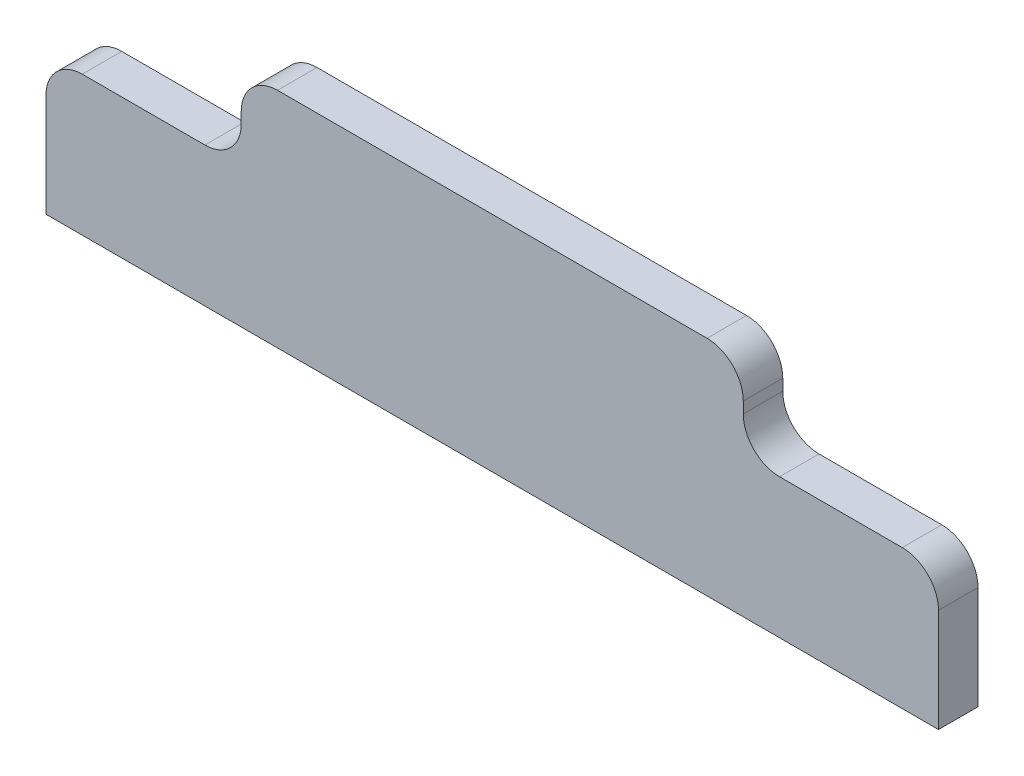
ISO-10303-21;
HEADER;
FILE_DESCRIPTION(('STEP AP214'),'2;1');
FILE_NAME('part.step','',(''),(''),'','','');
FILE_SCHEMA(('AUTOMOTIVE_DESIGN { 1 0 10303 214 1 1 1 1 }'));
ENDSEC;
DATA;
#1=APPLICATION_CONTEXT('core data for automotive mechanical design processes');
#2=APPLICATION_PROTOCOL_DEFINITION('international standard','automotive_design',2000,#1);
#3=PRODUCT_CONTEXT('',#1,'mechanical');
#4=PRODUCT('Part','Part','',(#3));
#5=PRODUCT_RELATED_PRODUCT_CATEGORY('part','',(#4));
#6=PRODUCT_DEFINITION_FORMATION('','',#4);
#7=PRODUCT_DEFINITION_CONTEXT('part definition',#1,'design');
#8=PRODUCT_DEFINITION('design','',#6,#7);
#9=PRODUCT_DEFINITION_SHAPE('','',#8);
#10=(LENGTH_UNIT() NAMED_UNIT(*) SI_UNIT(.MILLI.,.METRE.));
#11=(NAMED_UNIT(*) PLANE_ANGLE_UNIT() SI_UNIT($,.RADIAN.));
#12=(NAMED_UNIT(*) SI_UNIT($,.STERADIAN.) SOLID_ANGLE_UNIT());
#13=UNCERTAINTY_MEASURE_WITH_UNIT(LENGTH_MEASURE(1.E-05),#10,'distance_accuracy_value','');
#14=(GEOMETRIC_REPRESENTATION_CONTEXT(3) GLOBAL_UNCERTAINTY_ASSIGNED_CONTEXT((#13)) GLOBAL_UNIT_ASSIGNED_CONTEXT((#10,
#11,#12)) REPRESENTATION_CONTEXT('',''));
#15=CARTESIAN_POINT('',(0.,0.,0.));
#16=DIRECTION('',(0.,0.,1.));
#17=DIRECTION('',(1.,0.,0.));
#18=AXIS2_PLACEMENT_3D('',#15,#16,#17);
#19=CARTESIAN_POINT('',(203.2,101.6,17.9832));
#20=DIRECTION('',(0.,-1.,0.));
#21=DIRECTION('',(1.,0.,0.));
#22=AXIS2_PLACEMENT_3D('',#19,#20,#21);
#23=PLANE('',#22);
#24=DIRECTION('',(-1.,0.,0.));
#25=VECTOR('',#24,1.);
#26=CARTESIAN_POINT('',(203.2,101.6,0.));
#27=LINE('',#26,#25);
#28=CARTESIAN_POINT('',(97.79,101.6,0.));
#29=VERTEX_POINT('',#28);
#30=CARTESIAN_POINT('',(-97.79,101.6,0.));
#31=VERTEX_POINT('',#30);
#32=EDGE_CURVE('E171',#29,#31,#27,.T.);
#33=ORIENTED_EDGE('',*,*,#32,.T.);
#34=DIRECTION('',(0.,0.,1.));
#35=VECTOR('',#34,1.);
#36=CARTESIAN_POINT('',(-97.79,101.6,17.9832));
#37=LINE('',#36,#35);
#38=CARTESIAN_POINT('',(-97.79,101.6,17.9832));
#39=VERTEX_POINT('',#38);
#40=EDGE_CURVE('E195',#31,#39,#37,.T.);
#41=ORIENTED_EDGE('',*,*,#40,.T.);
#42=DIRECTION('',(-1.,0.,0.));
#43=VECTOR('',#42,1.);
#44=CARTESIAN_POINT('',(203.2,101.6,17.9832));
#45=LINE('',#44,#43);
#46=CARTESIAN_POINT('',(97.79,101.6,17.9832));
#47=VERTEX_POINT('',#46);
#48=EDGE_CURVE('E147',#47,#39,#45,.T.);
#49=ORIENTED_EDGE('',*,*,#48,.F.);
#50=DIRECTION('',(0.,0.,1.));
#51=VECTOR('',#50,1.);
#52=CARTESIAN_POINT('',(97.79,101.6,17.9832));
#53=LINE('',#52,#51);
#54=EDGE_CURVE('E193',#47,#29,#53,.F.);
#55=ORIENTED_EDGE('',*,*,#54,.T.);
#56=EDGE_LOOP('',(#33,#41,#49,#55));
#57=FACE_BOUND('',#56,.T.);
#58=ADVANCED_FACE('F34',(#57),#23,.F.);
#59=CARTESIAN_POINT('',(-203.2,101.6,17.9832));
#60=DIRECTION('',(1.,0.,0.));
#61=DIRECTION('',(0.,0.,-1.));
#62=AXIS2_PLACEMENT_3D('',#59,#60,#61);
#63=PLANE('',#62);
#64=DIRECTION('',(0.,-1.,0.));
#65=VECTOR('',#64,1.);
#66=CARTESIAN_POINT('',(-203.2,101.6,17.9832));
#67=LINE('',#66,#65);
#68=CARTESIAN_POINT('',(-203.2,46.99,17.9832));
#69=VERTEX_POINT('',#68);
#70=CARTESIAN_POINT('',(-203.2,0.,17.9832));
#71=VERTEX_POINT('',#70);
#72=EDGE_CURVE('E136',#69,#71,#67,.T.);
#73=ORIENTED_EDGE('',*,*,#72,.F.);
#74=DIRECTION('',(0.,0.,1.));
#75=VECTOR('',#74,1.);
#76=CARTESIAN_POINT('',(-203.2,46.99,17.9832));
#77=LINE('',#76,#75);
#78=CARTESIAN_POINT('',(-203.2,46.99,0.));
#79=VERTEX_POINT('',#78);
#80=EDGE_CURVE('E50',#69,#79,#77,.F.);
#81=ORIENTED_EDGE('',*,*,#80,.T.);
#82=DIRECTION('',(0.,-1.,0.));
#83=VECTOR('',#82,1.);
#84=CARTESIAN_POINT('',(-203.2,101.6,0.));
#85=LINE('',#84,#83);
#86=CARTESIAN_POINT('',(-203.2,0.,0.));
#87=VERTEX_POINT('',#86);
#88=EDGE_CURVE('E152',#79,#87,#85,.T.);
#89=ORIENTED_EDGE('',*,*,#88,.T.);
#90=DIRECTION('',(0.,0.,-1.));
#91=VECTOR('',#90,1.);
#92=CARTESIAN_POINT('',(-203.2,0.,17.9832));
#93=LINE('',#92,#91);
#94=EDGE_CURVE('E150',#71,#87,#93,.T.);
#95=ORIENTED_EDGE('',*,*,#94,.F.);
#96=EDGE_LOOP('',(#73,#81,#89,#95));
#97=FACE_BOUND('',#96,.T.);
#98=ADVANCED_FACE('F151',(#97),#63,.F.);
#99=CARTESIAN_POINT('',(203.2,0.,17.9832));
#100=DIRECTION('',(0.,1.,0.));
#101=DIRECTION('',(-1.,0.,0.));
#102=AXIS2_PLACEMENT_3D('',#99,#100,#101);
#103=PLANE('',#102);
#104=DIRECTION('',(1.,0.,0.));
#105=VECTOR('',#104,1.);
#106=CARTESIAN_POINT('',(203.2,0.,0.));
#107=LINE('',#106,#105);
#108=CARTESIAN_POINT('',(203.2,0.,0.));
#109=VERTEX_POINT('',#108);
#110=EDGE_CURVE('E177',#87,#109,#107,.T.);
#111=ORIENTED_EDGE('',*,*,#110,.T.);
#112=DIRECTION('',(0.,0.,-1.));
#113=VECTOR('',#112,1.);
#114=CARTESIAN_POINT('',(203.2,0.,17.9832));
#115=LINE('',#114,#113);
#116=CARTESIAN_POINT('',(203.2,0.,17.9832));
#117=VERTEX_POINT('',#116);
#118=EDGE_CURVE('E156',#117,#109,#115,.T.);
#119=ORIENTED_EDGE('',*,*,#118,.F.);
#120=DIRECTION('',(1.,0.,0.));
#121=VECTOR('',#120,1.);
#122=CARTESIAN_POINT('',(203.2,0.,17.9832));
#123=LINE('',#122,#121);
#124=EDGE_CURVE('E142',#71,#117,#123,.T.);
#125=ORIENTED_EDGE('',*,*,#124,.F.);
#126=ORIENTED_EDGE('',*,*,#94,.T.);
#127=EDGE_LOOP('',(#111,#119,#125,#126));
#128=FACE_BOUND('',#127,.T.);
#129=ADVANCED_FACE('F158',(#128),#103,.F.);
#130=CARTESIAN_POINT('',(203.2,101.6,17.9832));
#131=DIRECTION('',(-1.,0.,0.));
#132=DIRECTION('',(0.,0.,1.));
#133=AXIS2_PLACEMENT_3D('',#130,#131,#132);
#134=PLANE('',#133);
#135=DIRECTION('',(0.,1.,0.));
#136=VECTOR('',#135,1.);
#137=CARTESIAN_POINT('',(203.2,101.6,0.));
#138=LINE('',#137,#136);
#139=CARTESIAN_POINT('',(203.2,46.99,0.));
#140=VERTEX_POINT('',#139);
#141=EDGE_CURVE('E180',#109,#140,#138,.T.);
#142=ORIENTED_EDGE('',*,*,#141,.T.);
#143=DIRECTION('',(0.,0.,1.));
#144=VECTOR('',#143,1.);
#145=CARTESIAN_POINT('',(203.2,46.99,17.9832));
#146=LINE('',#145,#144);
#147=CARTESIAN_POINT('',(203.2,46.99,17.9832));
#148=VERTEX_POINT('',#147);
#149=EDGE_CURVE('E213',#140,#148,#146,.T.);
#150=ORIENTED_EDGE('',*,*,#149,.T.);
#151=DIRECTION('',(0.,1.,0.));
#152=VECTOR('',#151,1.);
#153=CARTESIAN_POINT('',(203.2,101.6,17.9832));
#154=LINE('',#153,#152);
#155=EDGE_CURVE('E162',#117,#148,#154,.T.);
#156=ORIENTED_EDGE('',*,*,#155,.F.);
#157=ORIENTED_EDGE('',*,*,#118,.T.);
#158=EDGE_LOOP('',(#142,#150,#156,#157));
#159=FACE_BOUND('',#158,.T.);
#160=ADVANCED_FACE('F299',(#159),#134,.F.);
#161=CARTESIAN_POINT('',(0.,0.,17.9832));
#162=DIRECTION('',(0.,0.,1.));
#163=DIRECTION('',(1.,0.,0.));
#164=AXIS2_PLACEMENT_3D('',#161,#162,#163);
#165=PLANE('',#164);
#166=ORIENTED_EDGE('',*,*,#48,.T.);
#167=CARTESIAN_POINT('',(-97.79,85.09,17.9832));
#168=DIRECTION('',(0.,0.,1.));
#169=DIRECTION('',(1.,0.,0.));
#170=AXIS2_PLACEMENT_3D('',#167,#168,#169);
#171=CIRCLE('',#170,16.51);
#172=CARTESIAN_POINT('',(-114.3,85.09,17.9832));
#173=VERTEX_POINT('',#172);
#174=EDGE_CURVE('E203',#39,#173,#171,.T.);
#175=ORIENTED_EDGE('',*,*,#174,.T.);
#176=DIRECTION('',(0.,1.,0.));
#177=VECTOR('',#176,1.);
#178=CARTESIAN_POINT('',(-114.3,101.6,17.9832));
#179=LINE('',#178,#177);
#180=CARTESIAN_POINT('',(-114.3,80.01,17.9832));
#181=VERTEX_POINT('',#180);
#182=EDGE_CURVE('E261',#181,#173,#179,.T.);
#183=ORIENTED_EDGE('',*,*,#182,.F.);
#184=CARTESIAN_POINT('',(-130.81,80.01,17.9832));
#185=DIRECTION('',(0.,0.,1.));
#186=DIRECTION('',(1.,0.,0.));
#187=AXIS2_PLACEMENT_3D('',#184,#185,#186);
#188=CIRCLE('',#187,16.51);
#189=CARTESIAN_POINT('',(-130.81,63.5,17.9832));
#190=VERTEX_POINT('',#189);
#191=EDGE_CURVE('E227',#181,#190,#188,.F.);
#192=ORIENTED_EDGE('',*,*,#191,.T.);
#193=DIRECTION('',(1.,0.,0.));
#194=VECTOR('',#193,1.);
#195=CARTESIAN_POINT('',(-203.2,63.5,17.9832));
#196=LINE('',#195,#194);
#197=CARTESIAN_POINT('',(-186.69,63.5,17.9832));
#198=VERTEX_POINT('',#197);
#199=EDGE_CURVE('E258',#198,#190,#196,.T.);
#200=ORIENTED_EDGE('',*,*,#199,.F.);
#201=CARTESIAN_POINT('',(-186.69,46.99,17.9832));
#202=DIRECTION('',(0.,0.,1.));
#203=DIRECTION('',(1.,0.,0.));
#204=AXIS2_PLACEMENT_3D('',#201,#202,#203);
#205=CIRCLE('',#204,16.51);
#206=EDGE_CURVE('E145',#198,#69,#205,.T.);
#207=ORIENTED_EDGE('',*,*,#206,.T.);
#208=ORIENTED_EDGE('',*,*,#72,.T.);
#209=ORIENTED_EDGE('',*,*,#124,.T.);
#210=ORIENTED_EDGE('',*,*,#155,.T.);
#211=CARTESIAN_POINT('',(186.69,46.99,17.9832));
#212=DIRECTION('',(0.,0.,1.));
#213=DIRECTION('',(1.,0.,0.));
#214=AXIS2_PLACEMENT_3D('',#211,#212,#213);
#215=CIRCLE('',#214,16.51);
#216=CARTESIAN_POINT('',(186.69,63.5,17.9832));
#217=VERTEX_POINT('',#216);
#218=EDGE_CURVE('E200',#148,#217,#215,.T.);
#219=ORIENTED_EDGE('',*,*,#218,.T.);
#220=DIRECTION('',(1.,0.,0.));
#221=VECTOR('',#220,1.);
#222=CARTESIAN_POINT('',(203.2,63.5,17.9832));
#223=LINE('',#222,#221);
#224=CARTESIAN_POINT('',(130.81,63.5,17.9832));
#225=VERTEX_POINT('',#224);
#226=EDGE_CURVE('E238',#225,#217,#223,.T.);
#227=ORIENTED_EDGE('',*,*,#226,.F.);
#228=CARTESIAN_POINT('',(130.81,80.01,17.9832));
#229=DIRECTION('',(0.,0.,1.));
#230=DIRECTION('',(1.,0.,0.));
#231=AXIS2_PLACEMENT_3D('',#228,#229,#230);
#232=CIRCLE('',#231,16.51);
#233=CARTESIAN_POINT('',(114.3,80.01,17.9832));
#234=VERTEX_POINT('',#233);
#235=EDGE_CURVE('E43',#225,#234,#232,.F.);
#236=ORIENTED_EDGE('',*,*,#235,.T.);
#237=DIRECTION('',(0.,-1.,0.));
#238=VECTOR('',#237,1.);
#239=CARTESIAN_POINT('',(114.3,101.6,17.9832));
#240=LINE('',#239,#238);
#241=CARTESIAN_POINT('',(114.3,85.09,17.9832));
#242=VERTEX_POINT('',#241);
#243=EDGE_CURVE('E236',#242,#234,#240,.T.);
#244=ORIENTED_EDGE('',*,*,#243,.F.);
#245=CARTESIAN_POINT('',(97.79,85.09,17.9832));
#246=DIRECTION('',(0.,0.,1.));
#247=DIRECTION('',(1.,0.,0.));
#248=AXIS2_PLACEMENT_3D('',#245,#246,#247);
#249=CIRCLE('',#248,16.51);
#250=EDGE_CURVE('E198',#242,#47,#249,.T.);
#251=ORIENTED_EDGE('',*,*,#250,.T.);
#252=EDGE_LOOP('',(#166,#175,#183,#192,#200,#207,#208,#209,#210,#219,#227,#236,#244,#251));
#253=FACE_BOUND('',#252,.T.);
#254=ADVANCED_FACE('F139',(#253),#165,.T.);
#255=CARTESIAN_POINT('',(0.,0.,0.));
#256=DIRECTION('',(0.,0.,1.));
#257=DIRECTION('',(1.,0.,0.));
#258=AXIS2_PLACEMENT_3D('',#255,#256,#257);
#259=PLANE('',#258);
#260=DIRECTION('',(0.,1.,0.));
#261=VECTOR('',#260,1.);
#262=CARTESIAN_POINT('',(-114.3,101.6,0.));
#263=LINE('',#262,#261);
#264=CARTESIAN_POINT('',(-114.3,80.01,0.));
#265=VERTEX_POINT('',#264);
#266=CARTESIAN_POINT('',(-114.3,85.09,0.));
#267=VERTEX_POINT('',#266);
#268=EDGE_CURVE('E175',#265,#267,#263,.T.);
#269=ORIENTED_EDGE('',*,*,#268,.T.);
#270=CARTESIAN_POINT('',(-97.79,85.09,0.));
#271=DIRECTION('',(0.,0.,1.));
#272=DIRECTION('',(1.,0.,0.));
#273=AXIS2_PLACEMENT_3D('',#270,#271,#272);
#274=CIRCLE('',#273,16.51);
#275=EDGE_CURVE('E210',#267,#31,#274,.F.);
#276=ORIENTED_EDGE('',*,*,#275,.T.);
#277=ORIENTED_EDGE('',*,*,#32,.F.);
#278=CARTESIAN_POINT('',(97.79,85.09,0.));
#279=DIRECTION('',(0.,0.,1.));
#280=DIRECTION('',(1.,0.,0.));
#281=AXIS2_PLACEMENT_3D('',#278,#279,#280);
#282=CIRCLE('',#281,16.51);
#283=CARTESIAN_POINT('',(114.3,85.09,0.));
#284=VERTEX_POINT('',#283);
#285=EDGE_CURVE('E205',#29,#284,#282,.F.);
#286=ORIENTED_EDGE('',*,*,#285,.T.);
#287=DIRECTION('',(0.,-1.,0.));
#288=VECTOR('',#287,1.);
#289=CARTESIAN_POINT('',(114.3,101.6,0.));
#290=LINE('',#289,#288);
#291=CARTESIAN_POINT('',(114.3,80.01,0.));
#292=VERTEX_POINT('',#291);
#293=EDGE_CURVE('E254',#284,#292,#290,.T.);
#294=ORIENTED_EDGE('',*,*,#293,.T.);
#295=CARTESIAN_POINT('',(130.81,80.01,0.));
#296=DIRECTION('',(0.,0.,1.));
#297=DIRECTION('',(1.,0.,0.));
#298=AXIS2_PLACEMENT_3D('',#295,#296,#297);
#299=CIRCLE('',#298,16.51);
#300=CARTESIAN_POINT('',(130.81,63.5,0.));
#301=VERTEX_POINT('',#300);
#302=EDGE_CURVE('E11',#292,#301,#299,.T.);
#303=ORIENTED_EDGE('',*,*,#302,.T.);
#304=DIRECTION('',(1.,0.,0.));
#305=VECTOR('',#304,1.);
#306=CARTESIAN_POINT('',(203.2,63.5,0.));
#307=LINE('',#306,#305);
#308=CARTESIAN_POINT('',(186.69,63.5,0.));
#309=VERTEX_POINT('',#308);
#310=EDGE_CURVE('E253',#301,#309,#307,.T.);
#311=ORIENTED_EDGE('',*,*,#310,.T.);
#312=CARTESIAN_POINT('',(186.69,46.99,0.));
#313=DIRECTION('',(0.,0.,1.));
#314=DIRECTION('',(1.,0.,0.));
#315=AXIS2_PLACEMENT_3D('',#312,#313,#314);
#316=CIRCLE('',#315,16.51);
#317=EDGE_CURVE('E58',#309,#140,#316,.F.);
#318=ORIENTED_EDGE('',*,*,#317,.T.);
#319=ORIENTED_EDGE('',*,*,#141,.F.);
#320=ORIENTED_EDGE('',*,*,#110,.F.);
#321=ORIENTED_EDGE('',*,*,#88,.F.);
#322=CARTESIAN_POINT('',(-186.69,46.99,0.));
#323=DIRECTION('',(0.,0.,1.));
#324=DIRECTION('',(1.,0.,0.));
#325=AXIS2_PLACEMENT_3D('',#322,#323,#324);
#326=CIRCLE('',#325,16.51);
#327=CARTESIAN_POINT('',(-186.69,63.5,0.));
#328=VERTEX_POINT('',#327);
#329=EDGE_CURVE('E208',#79,#328,#326,.F.);
#330=ORIENTED_EDGE('',*,*,#329,.T.);
#331=DIRECTION('',(1.,0.,0.));
#332=VECTOR('',#331,1.);
#333=CARTESIAN_POINT('',(-203.2,63.5,0.));
#334=LINE('',#333,#332);
#335=CARTESIAN_POINT('',(-130.81,63.5,0.));
#336=VERTEX_POINT('',#335);
#337=EDGE_CURVE('E266',#328,#336,#334,.T.);
#338=ORIENTED_EDGE('',*,*,#337,.T.);
#339=CARTESIAN_POINT('',(-130.81,80.01,0.));
#340=DIRECTION('',(0.,0.,1.));
#341=DIRECTION('',(1.,0.,0.));
#342=AXIS2_PLACEMENT_3D('',#339,#340,#341);
#343=CIRCLE('',#342,16.51);
#344=EDGE_CURVE('E229',#336,#265,#343,.T.);
#345=ORIENTED_EDGE('',*,*,#344,.T.);
#346=EDGE_LOOP('',(#269,#276,#277,#286,#294,#303,#311,#318,#319,#320,#321,#330,#338,#345));
#347=FACE_BOUND('',#346,.T.);
#348=ADVANCED_FACE('F252',(#347),#259,.F.);
#349=CARTESIAN_POINT('',(-114.3,101.6,0.));
#350=DIRECTION('',(1.,0.,0.));
#351=DIRECTION('',(0.,1.,0.));
#352=AXIS2_PLACEMENT_3D('',#349,#350,#351);
#353=PLANE('',#352);
#354=ORIENTED_EDGE('',*,*,#268,.F.);
#355=DIRECTION('',(0.,0.,1.));
#356=VECTOR('',#355,1.);
#357=CARTESIAN_POINT('',(-114.3,80.01,17.9832));
#358=LINE('',#357,#356);
#359=EDGE_CURVE('E185',#265,#181,#358,.T.);
#360=ORIENTED_EDGE('',*,*,#359,.T.);
#361=ORIENTED_EDGE('',*,*,#182,.T.);
#362=DIRECTION('',(0.,0.,1.));
#363=VECTOR('',#362,1.);
#364=CARTESIAN_POINT('',(-114.3,85.09,0.));
#365=LINE('',#364,#363);
#366=EDGE_CURVE('E155',#173,#267,#365,.F.);
#367=ORIENTED_EDGE('',*,*,#366,.T.);
#368=EDGE_LOOP('',(#354,#360,#361,#367));
#369=FACE_BOUND('',#368,.T.);
#370=ADVANCED_FACE('F285',(#369),#353,.F.);
#371=CARTESIAN_POINT('',(-203.2,63.5,0.));
#372=DIRECTION('',(0.,-1.,0.));
#373=DIRECTION('',(0.,0.,-1.));
#374=AXIS2_PLACEMENT_3D('',#371,#372,#373);
#375=PLANE('',#374);
#376=ORIENTED_EDGE('',*,*,#199,.T.);
#377=DIRECTION('',(0.,0.,1.));
#378=VECTOR('',#377,1.);
#379=CARTESIAN_POINT('',(-130.81,63.5,0.));
#380=LINE('',#379,#378);
#381=EDGE_CURVE('E191',#190,#336,#380,.F.);
#382=ORIENTED_EDGE('',*,*,#381,.T.);
#383=ORIENTED_EDGE('',*,*,#337,.F.);
#384=DIRECTION('',(0.,0.,1.));
#385=VECTOR('',#384,1.);
#386=CARTESIAN_POINT('',(-186.69,63.5,0.));
#387=LINE('',#386,#385);
#388=EDGE_CURVE('E188',#328,#198,#387,.T.);
#389=ORIENTED_EDGE('',*,*,#388,.T.);
#390=EDGE_LOOP('',(#376,#382,#383,#389));
#391=FACE_BOUND('',#390,.T.);
#392=ADVANCED_FACE('F293',(#391),#375,.F.);
#393=CARTESIAN_POINT('',(203.2,63.5,0.));
#394=DIRECTION('',(0.,-1.,0.));
#395=DIRECTION('',(1.,0.,0.));
#396=AXIS2_PLACEMENT_3D('',#393,#394,#395);
#397=PLANE('',#396);
#398=ORIENTED_EDGE('',*,*,#226,.T.);
#399=DIRECTION('',(0.,0.,1.));
#400=VECTOR('',#399,1.);
#401=CARTESIAN_POINT('',(186.69,63.5,0.));
#402=LINE('',#401,#400);
#403=EDGE_CURVE('E219',#217,#309,#402,.F.);
#404=ORIENTED_EDGE('',*,*,#403,.T.);
#405=ORIENTED_EDGE('',*,*,#310,.F.);
#406=DIRECTION('',(0.,0.,1.));
#407=VECTOR('',#406,1.);
#408=CARTESIAN_POINT('',(130.81,63.5,17.9832));
#409=LINE('',#408,#407);
#410=EDGE_CURVE('E216',#301,#225,#409,.T.);
#411=ORIENTED_EDGE('',*,*,#410,.T.);
#412=EDGE_LOOP('',(#398,#404,#405,#411));
#413=FACE_BOUND('',#412,.T.);
#414=ADVANCED_FACE('F256',(#413),#397,.F.);
#415=CARTESIAN_POINT('',(114.3,101.6,0.));
#416=DIRECTION('',(-1.,0.,0.));
#417=DIRECTION('',(0.,-1.,0.));
#418=AXIS2_PLACEMENT_3D('',#415,#416,#417);
#419=PLANE('',#418);
#420=ORIENTED_EDGE('',*,*,#243,.T.);
#421=DIRECTION('',(0.,0.,1.));
#422=VECTOR('',#421,1.);
#423=CARTESIAN_POINT('',(114.3,80.01,0.));
#424=LINE('',#423,#422);
#425=EDGE_CURVE('E225',#234,#292,#424,.F.);
#426=ORIENTED_EDGE('',*,*,#425,.T.);
#427=ORIENTED_EDGE('',*,*,#293,.F.);
#428=DIRECTION('',(0.,0.,1.));
#429=VECTOR('',#428,1.);
#430=CARTESIAN_POINT('',(114.3,85.09,0.));
#431=LINE('',#430,#429);
#432=EDGE_CURVE('E221',#284,#242,#431,.T.);
#433=ORIENTED_EDGE('',*,*,#432,.T.);
#434=EDGE_LOOP('',(#420,#426,#427,#433));
#435=FACE_BOUND('',#434,.T.);
#436=ADVANCED_FACE('F243',(#435),#419,.F.);
#437=CARTESIAN_POINT('',(-130.81,80.01,0.));
#438=DIRECTION('',(0.,0.,-1.));
#439=DIRECTION('',(-1.,0.,0.));
#440=AXIS2_PLACEMENT_3D('',#437,#438,#439);
#441=CYLINDRICAL_SURFACE('',#440,16.51);
#442=ORIENTED_EDGE('',*,*,#344,.F.);
#443=ORIENTED_EDGE('',*,*,#381,.F.);
#444=ORIENTED_EDGE('',*,*,#191,.F.);
#445=ORIENTED_EDGE('',*,*,#359,.F.);
#446=EDGE_LOOP('',(#442,#443,#444,#445));
#447=FACE_BOUND('',#446,.T.);
#448=ADVANCED_FACE('F291',(#447),#441,.F.);
#449=CARTESIAN_POINT('',(-97.79,85.09,17.9832));
#450=DIRECTION('',(0.,0.,1.));
#451=DIRECTION('',(1.,0.,0.));
#452=AXIS2_PLACEMENT_3D('',#449,#450,#451);
#453=CYLINDRICAL_SURFACE('',#452,16.51);
#454=ORIENTED_EDGE('',*,*,#275,.F.);
#455=ORIENTED_EDGE('',*,*,#366,.F.);
#456=ORIENTED_EDGE('',*,*,#174,.F.);
#457=ORIENTED_EDGE('',*,*,#40,.F.);
#458=EDGE_LOOP('',(#454,#455,#456,#457));
#459=FACE_BOUND('',#458,.T.);
#460=ADVANCED_FACE('F281',(#459),#453,.T.);
#461=CARTESIAN_POINT('',(-186.69,46.99,0.));
#462=DIRECTION('',(0.,0.,1.));
#463=DIRECTION('',(1.,0.,0.));
#464=AXIS2_PLACEMENT_3D('',#461,#462,#463);
#465=CYLINDRICAL_SURFACE('',#464,16.51);
#466=ORIENTED_EDGE('',*,*,#329,.F.);
#467=ORIENTED_EDGE('',*,*,#80,.F.);
#468=ORIENTED_EDGE('',*,*,#206,.F.);
#469=ORIENTED_EDGE('',*,*,#388,.F.);
#470=EDGE_LOOP('',(#466,#467,#468,#469));
#471=FACE_BOUND('',#470,.T.);
#472=ADVANCED_FACE('F297',(#471),#465,.T.);
#473=CARTESIAN_POINT('',(186.69,46.99,17.9832));
#474=DIRECTION('',(0.,0.,1.));
#475=DIRECTION('',(1.,0.,0.));
#476=AXIS2_PLACEMENT_3D('',#473,#474,#475);
#477=CYLINDRICAL_SURFACE('',#476,16.51);
#478=ORIENTED_EDGE('',*,*,#317,.F.);
#479=ORIENTED_EDGE('',*,*,#403,.F.);
#480=ORIENTED_EDGE('',*,*,#218,.F.);
#481=ORIENTED_EDGE('',*,*,#149,.F.);
#482=EDGE_LOOP('',(#478,#479,#480,#481));
#483=FACE_BOUND('',#482,.T.);
#484=ADVANCED_FACE('F302',(#483),#477,.T.);
#485=CARTESIAN_POINT('',(130.81,80.01,0.));
#486=DIRECTION('',(0.,0.,-1.));
#487=DIRECTION('',(-1.,0.,0.));
#488=AXIS2_PLACEMENT_3D('',#485,#486,#487);
#489=CYLINDRICAL_SURFACE('',#488,16.51);
#490=ORIENTED_EDGE('',*,*,#302,.F.);
#491=ORIENTED_EDGE('',*,*,#425,.F.);
#492=ORIENTED_EDGE('',*,*,#235,.F.);
#493=ORIENTED_EDGE('',*,*,#410,.F.);
#494=EDGE_LOOP('',(#490,#491,#492,#493));
#495=FACE_BOUND('',#494,.T.);
#496=ADVANCED_FACE('F249',(#495),#489,.F.);
#497=CARTESIAN_POINT('',(97.79,85.09,0.));
#498=DIRECTION('',(0.,0.,1.));
#499=DIRECTION('',(1.,0.,0.));
#500=AXIS2_PLACEMENT_3D('',#497,#498,#499);
#501=CYLINDRICAL_SURFACE('',#500,16.51);
#502=ORIENTED_EDGE('',*,*,#285,.F.);
#503=ORIENTED_EDGE('',*,*,#54,.F.);
#504=ORIENTED_EDGE('',*,*,#250,.F.);
#505=ORIENTED_EDGE('',*,*,#432,.F.);
#506=EDGE_LOOP('',(#502,#503,#504,#505));
#507=FACE_BOUND('',#506,.T.);
#508=ADVANCED_FACE('F36',(#507),#501,.T.);
#509=CLOSED_SHELL('',(#58,#98,#129,#160,#254,#348,#370,#392,#414,#436,#448,#460,#472,#484,#496,#508));
#510=MANIFOLD_SOLID_BREP('B2',#509);
#511=ADVANCED_BREP_SHAPE_REPRESENTATION('',(#18,#510),#14);
#512=SHAPE_DEFINITION_REPRESENTATION(#9,#511);
ENDSEC;
END-ISO-10303-21;
